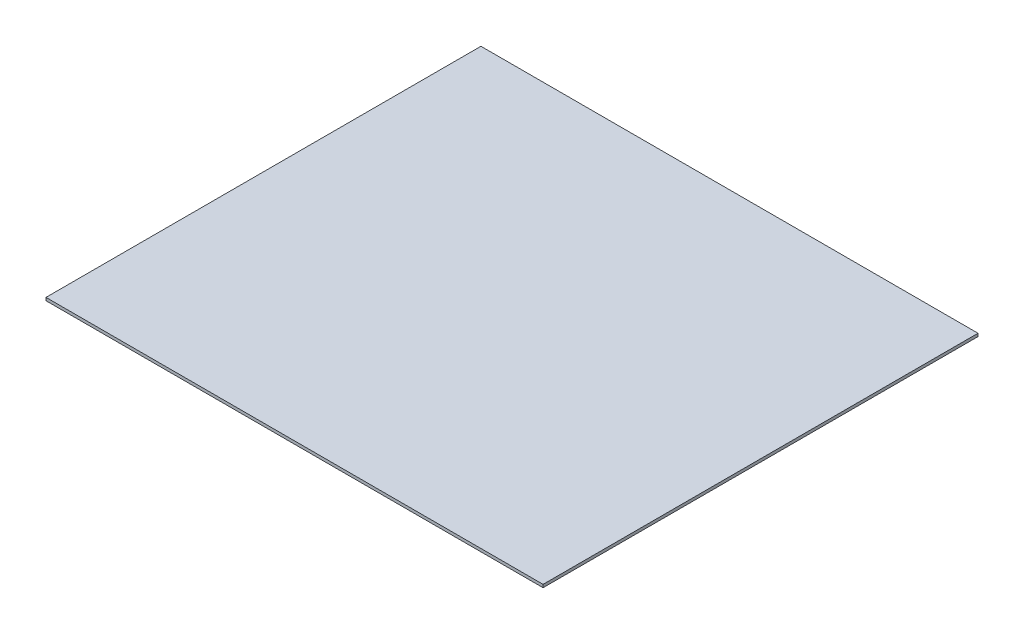
ISO-10303-21;
HEADER;
FILE_DESCRIPTION(('STEP AP214'),'2;1');
FILE_NAME('part.step','',(''),(''),'','','');
FILE_SCHEMA(('AUTOMOTIVE_DESIGN { 1 0 10303 214 1 1 1 1 }'));
ENDSEC;
DATA;
#1=APPLICATION_CONTEXT('core data for automotive mechanical design processes');
#2=APPLICATION_PROTOCOL_DEFINITION('international standard','automotive_design',2000,#1);
#3=PRODUCT_CONTEXT('',#1,'mechanical');
#4=PRODUCT('Part','Part','',(#3));
#5=PRODUCT_RELATED_PRODUCT_CATEGORY('part','',(#4));
#6=PRODUCT_DEFINITION_FORMATION('','',#4);
#7=PRODUCT_DEFINITION_CONTEXT('part definition',#1,'design');
#8=PRODUCT_DEFINITION('design','',#6,#7);
#9=PRODUCT_DEFINITION_SHAPE('','',#8);
#10=(LENGTH_UNIT() NAMED_UNIT(*) SI_UNIT(.MILLI.,.METRE.));
#11=(NAMED_UNIT(*) PLANE_ANGLE_UNIT() SI_UNIT($,.RADIAN.));
#12=(NAMED_UNIT(*) SI_UNIT($,.STERADIAN.) SOLID_ANGLE_UNIT());
#13=UNCERTAINTY_MEASURE_WITH_UNIT(LENGTH_MEASURE(1.E-05),#10,'distance_accuracy_value','');
#14=(GEOMETRIC_REPRESENTATION_CONTEXT(3) GLOBAL_UNCERTAINTY_ASSIGNED_CONTEXT((#13)) GLOBAL_UNIT_ASSIGNED_CONTEXT((#10,
#11,#12)) REPRESENTATION_CONTEXT('',''));
#15=CARTESIAN_POINT('',(0.,0.,0.));
#16=DIRECTION('',(0.,0.,1.));
#17=DIRECTION('',(1.,0.,0.));
#18=AXIS2_PLACEMENT_3D('',#15,#16,#17);
#19=CARTESIAN_POINT('',(406.4,4.8,-355.6));
#20=DIRECTION('',(-1.,0.,0.));
#21=DIRECTION('',(0.,0.,1.));
#22=AXIS2_PLACEMENT_3D('',#19,#20,#21);
#23=PLANE('',#22);
#24=DIRECTION('',(0.,0.,-1.));
#25=VECTOR('',#24,1.);
#26=CARTESIAN_POINT('',(406.4,0.,-355.6));
#27=LINE('',#26,#25);
#28=CARTESIAN_POINT('',(406.4,0.,355.6));
#29=VERTEX_POINT('',#28);
#30=CARTESIAN_POINT('',(406.4,0.,-355.6));
#31=VERTEX_POINT('',#30);
#32=EDGE_CURVE('E113',#29,#31,#27,.T.);
#33=ORIENTED_EDGE('',*,*,#32,.T.);
#34=DIRECTION('',(0.,-1.,0.));
#35=VECTOR('',#34,1.);
#36=CARTESIAN_POINT('',(406.4,4.8,-355.6));
#37=LINE('',#36,#35);
#38=CARTESIAN_POINT('',(406.4,4.8,-355.6));
#39=VERTEX_POINT('',#38);
#40=EDGE_CURVE('E11',#39,#31,#37,.T.);
#41=ORIENTED_EDGE('',*,*,#40,.F.);
#42=DIRECTION('',(0.,0.,-1.));
#43=VECTOR('',#42,1.);
#44=CARTESIAN_POINT('',(406.4,4.8,-355.6));
#45=LINE('',#44,#43);
#46=CARTESIAN_POINT('',(406.4,4.8,355.6));
#47=VERTEX_POINT('',#46);
#48=EDGE_CURVE('E97',#47,#39,#45,.T.);
#49=ORIENTED_EDGE('',*,*,#48,.F.);
#50=DIRECTION('',(0.,-1.,0.));
#51=VECTOR('',#50,1.);
#52=CARTESIAN_POINT('',(406.4,4.8,355.6));
#53=LINE('',#52,#51);
#54=EDGE_CURVE('E109',#47,#29,#53,.T.);
#55=ORIENTED_EDGE('',*,*,#54,.T.);
#56=EDGE_LOOP('',(#33,#41,#49,#55));
#57=FACE_BOUND('',#56,.T.);
#58=ADVANCED_FACE('F45',(#57),#23,.F.);
#59=CARTESIAN_POINT('',(-406.4,4.8,-355.6));
#60=DIRECTION('',(0.,0.,1.));
#61=DIRECTION('',(1.,0.,0.));
#62=AXIS2_PLACEMENT_3D('',#59,#60,#61);
#63=PLANE('',#62);
#64=DIRECTION('',(-1.,0.,0.));
#65=VECTOR('',#64,1.);
#66=CARTESIAN_POINT('',(-406.4,0.,-355.6));
#67=LINE('',#66,#65);
#68=CARTESIAN_POINT('',(-406.4,0.,-355.6));
#69=VERTEX_POINT('',#68);
#70=EDGE_CURVE('E102',#31,#69,#67,.T.);
#71=ORIENTED_EDGE('',*,*,#70,.T.);
#72=DIRECTION('',(0.,-1.,0.));
#73=VECTOR('',#72,1.);
#74=CARTESIAN_POINT('',(-406.4,4.8,-355.6));
#75=LINE('',#74,#73);
#76=CARTESIAN_POINT('',(-406.4,4.8,-355.6));
#77=VERTEX_POINT('',#76);
#78=EDGE_CURVE('E54',#77,#69,#75,.T.);
#79=ORIENTED_EDGE('',*,*,#78,.F.);
#80=DIRECTION('',(-1.,0.,0.));
#81=VECTOR('',#80,1.);
#82=CARTESIAN_POINT('',(-406.4,4.8,-355.6));
#83=LINE('',#82,#81);
#84=EDGE_CURVE('E92',#39,#77,#83,.T.);
#85=ORIENTED_EDGE('',*,*,#84,.F.);
#86=ORIENTED_EDGE('',*,*,#40,.T.);
#87=EDGE_LOOP('',(#71,#79,#85,#86));
#88=FACE_BOUND('',#87,.T.);
#89=ADVANCED_FACE('F101',(#88),#63,.F.);
#90=CARTESIAN_POINT('',(-406.4,4.8,-355.6));
#91=DIRECTION('',(1.,0.,0.));
#92=DIRECTION('',(0.,0.,-1.));
#93=AXIS2_PLACEMENT_3D('',#90,#91,#92);
#94=PLANE('',#93);
#95=DIRECTION('',(0.,0.,1.));
#96=VECTOR('',#95,1.);
#97=CARTESIAN_POINT('',(-406.4,0.,-355.6));
#98=LINE('',#97,#96);
#99=CARTESIAN_POINT('',(-406.4,0.,355.6));
#100=VERTEX_POINT('',#99);
#101=EDGE_CURVE('E79',#69,#100,#98,.T.);
#102=ORIENTED_EDGE('',*,*,#101,.T.);
#103=DIRECTION('',(0.,-1.,0.));
#104=VECTOR('',#103,1.);
#105=CARTESIAN_POINT('',(-406.4,4.8,355.6));
#106=LINE('',#105,#104);
#107=CARTESIAN_POINT('',(-406.4,4.8,355.6));
#108=VERTEX_POINT('',#107);
#109=EDGE_CURVE('E104',#108,#100,#106,.T.);
#110=ORIENTED_EDGE('',*,*,#109,.F.);
#111=DIRECTION('',(0.,0.,1.));
#112=VECTOR('',#111,1.);
#113=CARTESIAN_POINT('',(-406.4,4.8,-355.6));
#114=LINE('',#113,#112);
#115=EDGE_CURVE('E95',#77,#108,#114,.T.);
#116=ORIENTED_EDGE('',*,*,#115,.F.);
#117=ORIENTED_EDGE('',*,*,#78,.T.);
#118=EDGE_LOOP('',(#102,#110,#116,#117));
#119=FACE_BOUND('',#118,.T.);
#120=ADVANCED_FACE('F105',(#119),#94,.F.);
#121=CARTESIAN_POINT('',(-406.4,4.8,355.6));
#122=DIRECTION('',(0.,0.,-1.));
#123=DIRECTION('',(-1.,0.,0.));
#124=AXIS2_PLACEMENT_3D('',#121,#122,#123);
#125=PLANE('',#124);
#126=DIRECTION('',(1.,0.,0.));
#127=VECTOR('',#126,1.);
#128=CARTESIAN_POINT('',(-406.4,0.,355.6));
#129=LINE('',#128,#127);
#130=EDGE_CURVE('E85',#100,#29,#129,.T.);
#131=ORIENTED_EDGE('',*,*,#130,.T.);
#132=ORIENTED_EDGE('',*,*,#54,.F.);
#133=DIRECTION('',(1.,0.,0.));
#134=VECTOR('',#133,1.);
#135=CARTESIAN_POINT('',(-406.4,4.8,355.6));
#136=LINE('',#135,#134);
#137=EDGE_CURVE('E62',#108,#47,#136,.T.);
#138=ORIENTED_EDGE('',*,*,#137,.F.);
#139=ORIENTED_EDGE('',*,*,#109,.T.);
#140=EDGE_LOOP('',(#131,#132,#138,#139));
#141=FACE_BOUND('',#140,.T.);
#142=ADVANCED_FACE('F126',(#141),#125,.F.);
#143=CARTESIAN_POINT('',(0.,4.8,0.));
#144=DIRECTION('',(0.,1.,0.));
#145=DIRECTION('',(0.,0.,1.));
#146=AXIS2_PLACEMENT_3D('',#143,#144,#145);
#147=PLANE('',#146);
#148=ORIENTED_EDGE('',*,*,#48,.T.);
#149=ORIENTED_EDGE('',*,*,#84,.T.);
#150=ORIENTED_EDGE('',*,*,#115,.T.);
#151=ORIENTED_EDGE('',*,*,#137,.T.);
#152=EDGE_LOOP('',(#148,#149,#150,#151));
#153=FACE_BOUND('',#152,.T.);
#154=ADVANCED_FACE('F93',(#153),#147,.T.);
#155=CARTESIAN_POINT('',(0.,0.,0.));
#156=DIRECTION('',(0.,1.,0.));
#157=DIRECTION('',(0.,0.,1.));
#158=AXIS2_PLACEMENT_3D('',#155,#156,#157);
#159=PLANE('',#158);
#160=ORIENTED_EDGE('',*,*,#32,.F.);
#161=ORIENTED_EDGE('',*,*,#130,.F.);
#162=ORIENTED_EDGE('',*,*,#101,.F.);
#163=ORIENTED_EDGE('',*,*,#70,.F.);
#164=EDGE_LOOP('',(#160,#161,#162,#163));
#165=FACE_BOUND('',#164,.T.);
#166=ADVANCED_FACE('F129',(#165),#159,.F.);
#167=CLOSED_SHELL('',(#58,#89,#120,#142,#154,#166));
#168=MANIFOLD_SOLID_BREP('B2',#167);
#169=ADVANCED_BREP_SHAPE_REPRESENTATION('',(#18,#168),#14);
#170=SHAPE_DEFINITION_REPRESENTATION(#9,#169);
ENDSEC;
END-ISO-10303-21;
